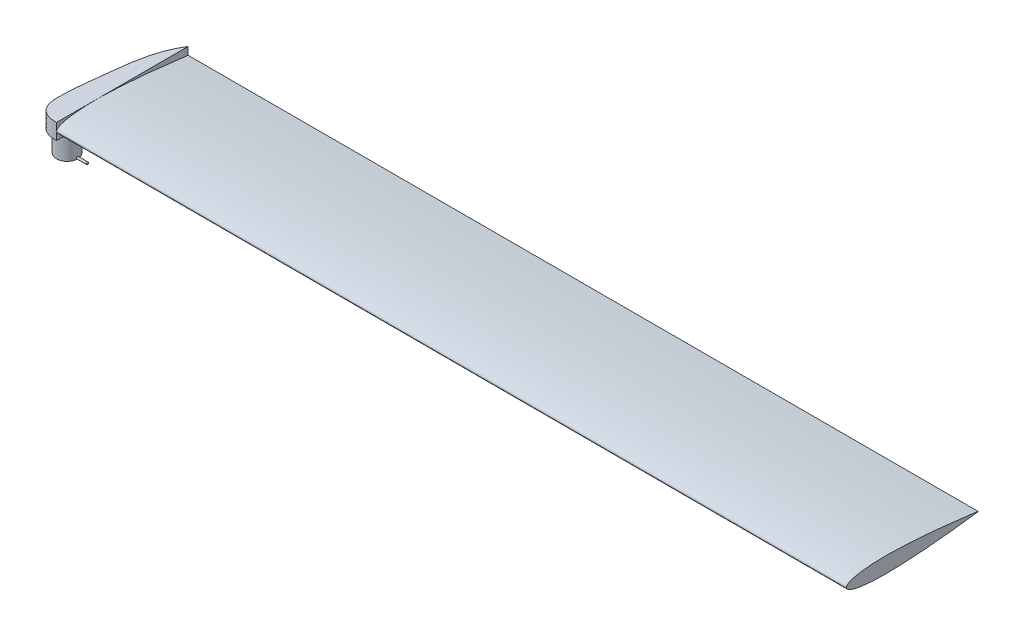
ISO-10303-21;
HEADER;
FILE_DESCRIPTION(('STEP AP214'),'2;1');
FILE_NAME('part.step','',(''),(''),'','','');
FILE_SCHEMA(('AUTOMOTIVE_DESIGN { 1 0 10303 214 1 1 1 1 }'));
ENDSEC;
DATA;
#1=APPLICATION_CONTEXT('core data for automotive mechanical design processes');
#2=APPLICATION_PROTOCOL_DEFINITION('international standard','automotive_design',2000,#1);
#3=PRODUCT_CONTEXT('',#1,'mechanical');
#4=PRODUCT('Part','Part','',(#3));
#5=PRODUCT_RELATED_PRODUCT_CATEGORY('part','',(#4));
#6=PRODUCT_DEFINITION_FORMATION('','',#4);
#7=PRODUCT_DEFINITION_CONTEXT('part definition',#1,'design');
#8=PRODUCT_DEFINITION('design','',#6,#7);
#9=PRODUCT_DEFINITION_SHAPE('','',#8);
#10=(LENGTH_UNIT() NAMED_UNIT(*) SI_UNIT(.MILLI.,.METRE.));
#11=(NAMED_UNIT(*) PLANE_ANGLE_UNIT() SI_UNIT($,.RADIAN.));
#12=(NAMED_UNIT(*) SI_UNIT($,.STERADIAN.) SOLID_ANGLE_UNIT());
#13=UNCERTAINTY_MEASURE_WITH_UNIT(LENGTH_MEASURE(1.E-05),#10,'distance_accuracy_value','');
#14=(GEOMETRIC_REPRESENTATION_CONTEXT(3) GLOBAL_UNCERTAINTY_ASSIGNED_CONTEXT((#13)) GLOBAL_UNIT_ASSIGNED_CONTEXT((#10,
#11,#12)) REPRESENTATION_CONTEXT('',''));
#15=CARTESIAN_POINT('',(0.,0.,0.));
#16=DIRECTION('',(0.,0.,1.));
#17=DIRECTION('',(1.,0.,0.));
#18=AXIS2_PLACEMENT_3D('',#15,#16,#17);
#19=CARTESIAN_POINT('',(-10.,-25.,-19.9998762848548));
#20=DIRECTION('',(0.,1.,0.));
#21=DIRECTION('',(0.,0.,1.));
#22=AXIS2_PLACEMENT_3D('',#19,#20,#21);
#23=CYLINDRICAL_SURFACE('',#22,10.);
#24=CARTESIAN_POINT('',(-10.,0.,-19.9998762848548));
#25=DIRECTION('',(0.,-1.,0.));
#26=DIRECTION('',(0.,0.,-1.));
#27=AXIS2_PLACEMENT_3D('',#24,#25,#26);
#28=CIRCLE('',#27,10.);
#29=CARTESIAN_POINT('',(0.,0.,-19.9998762848548));
#30=VERTEX_POINT('',#29);
#31=CARTESIAN_POINT('',(-19.9897457325701,0.,-19.5471288954677));
#32=VERTEX_POINT('',#31);
#33=EDGE_CURVE('E61',#30,#32,#28,.T.);
#34=ORIENTED_EDGE('',*,*,#33,.T.);
#35=CARTESIAN_POINT('',(-20.,0.,-19.9998762848548));
#36=CARTESIAN_POINT('',(-19.9960821326151,0.,-19.7722071167072));
#37=CARTESIAN_POINT('',(-19.9897457325701,0.,-19.5471288954679));
#38=B_SPLINE_CURVE_WITH_KNOTS('',2,(#35,#36,#37),.UNSPECIFIED.,.F.,.F.,(3,3),(0.988805697326739,
1.),.UNSPECIFIED.);
#39=CARTESIAN_POINT('',(-20.0000000000001,0.,-19.9998762848548));
#40=VERTEX_POINT('',#39);
#41=EDGE_CURVE('E120',#32,#40,#38,.F.);
#42=ORIENTED_EDGE('',*,*,#41,.T.);
#43=CARTESIAN_POINT('',(-10.,0.,-19.9998762848548));
#44=DIRECTION('',(0.,1.,0.));
#45=DIRECTION('',(0.,0.,1.));
#46=AXIS2_PLACEMENT_3D('',#43,#44,#45);
#47=CIRCLE('',#46,10.);
#48=EDGE_CURVE('E11',#40,#30,#47,.F.);
#49=ORIENTED_EDGE('',*,*,#48,.T.);
#50=EDGE_LOOP('',(#34,#42,#49));
#51=FACE_BOUND('',#50,.T.);
#52=CARTESIAN_POINT('',(-10.,-25.,-19.9998762848548));
#53=DIRECTION('',(0.,-1.,0.));
#54=DIRECTION('',(0.,0.,-1.));
#55=AXIS2_PLACEMENT_3D('',#52,#53,#54);
#56=CIRCLE('',#55,10.);
#57=CARTESIAN_POINT('',(0.,-25.,-19.9998762848548));
#58=VERTEX_POINT('',#57);
#59=EDGE_CURVE('E113',#58,#58,#56,.T.);
#60=ORIENTED_EDGE('',*,*,#59,.F.);
#61=CARTESIAN_POINT('',(-0.0501256289337955,-24.,-20.9998762848549));
#62=CARTESIAN_POINT('',(-0.0501249720309668,-23.9439804358264,-20.9998738582484));
#63=CARTESIAN_POINT('',(-0.0496474300578145,-23.8879238315882,-20.9951531438373));
#64=CARTESIAN_POINT('',(-0.0477891244188077,-23.7773648137065,-20.9763925996184));
#65=CARTESIAN_POINT('',(-0.0464073653878054,-23.7228641819625,-20.9623424997413));
#66=CARTESIAN_POINT('',(-0.0428986695261224,-23.6170341807821,-20.9253364009238));
#67=CARTESIAN_POINT('',(-0.0407721845320985,-23.5657029106086,-20.9023858011488));
#68=CARTESIAN_POINT('',(-0.0360141942817911,-23.4676322077082,-20.848240552246));
#69=CARTESIAN_POINT('',(-0.0333827893567064,-23.4208918655163,-20.8170475404808));
#70=CARTESIAN_POINT('',(-0.0279007329010098,-23.3331487363425,-20.7471810468536));
#71=CARTESIAN_POINT('',(-0.0250493999473345,-23.2921649904962,-20.7084837029631));
#72=CARTESIAN_POINT('',(-0.0194549476428063,-23.2172623909964,-20.6247580001744));
#73=CARTESIAN_POINT('',(-0.0167118332478677,-23.1833438605937,-20.5797293517614));
#74=CARTESIAN_POINT('',(-0.0116361684439486,-23.1234687429928,-20.4845026465058));
#75=CARTESIAN_POINT('',(-0.00930449105352558,-23.0975290012063,-20.4342939473844));
#76=CARTESIAN_POINT('',(-0.00532183124228876,-23.0544555668513,-20.3302062691424));
#77=CARTESIAN_POINT('',(-0.00367083222935588,-23.0373216596305,-20.2763273795231));
#78=CARTESIAN_POINT('',(-0.00124033428973726,-23.0124020906468,-20.1666210675978));
#79=CARTESIAN_POINT('',(-0.00045792157182856,-23.0045851672501,-20.1108008118864));
#80=CARTESIAN_POINT('',(0.000157155986929122,-22.9984247308663,-19.9986355441659));
#81=CARTESIAN_POINT('',(-1.01545472688703E-05,-23.0000809722537,-19.9422905458004));
#82=CARTESIAN_POINT('',(-0.00127328688813906,-23.0127944726502,-19.8308874407903));
#83=CARTESIAN_POINT('',(-0.00236578848286872,-23.0238181155639,-19.7758254549199));
#84=CARTESIAN_POINT('',(-0.00535270735069322,-23.0549011289466,-19.6683371053503));
#85=CARTESIAN_POINT('',(-0.00724713504046299,-23.0749606167876,-19.6159107758971));
#86=CARTESIAN_POINT('',(-0.0116306251608414,-23.1235827632544,-19.5150759701753));
#87=CARTESIAN_POINT('',(-0.0141207263424173,-23.1521602975302,-19.4666747138732));
#88=CARTESIAN_POINT('',(-0.0194161548059212,-23.2169965233364,-19.3753427716807));
#89=CARTESIAN_POINT('',(-0.0222214913318861,-23.2532554401452,-19.332412246294));
#90=CARTESIAN_POINT('',(-0.0278470653214824,-23.3326142295136,-19.2530435130322));
#91=CARTESIAN_POINT('',(-0.0306673142697208,-23.3757433447416,-19.2166345386645));
#92=CARTESIAN_POINT('',(-0.0359926007177727,-23.4675168652108,-19.1515687494969));
#93=CARTESIAN_POINT('',(-0.0384976377603513,-23.5161612784521,-19.122911945942));
#94=CARTESIAN_POINT('',(-0.0429091048585014,-23.6176070251998,-19.0741641002816));
#95=CARTESIAN_POINT('',(-0.0448154086744486,-23.6704092324229,-19.0540748642819));
#96=CARTESIAN_POINT('',(-0.0478109812906173,-23.7786606046147,-19.0230555492173));
#97=CARTESIAN_POINT('',(-0.0489002749823136,-23.8341096888874,-19.0121251911118));
#98=CARTESIAN_POINT('',(-0.0501341947258268,-23.9458241795295,-18.9997715094629));
#99=CARTESIAN_POINT('',(-0.0502828845239615,-24.0020850202648,-18.9983072882076));
#100=CARTESIAN_POINT('',(-0.0496294864522809,-24.1140512658229,-19.0048200379835));
#101=CARTESIAN_POINT('',(-0.0488274114293835,-24.1697566781404,-19.0127968814451));
#102=CARTESIAN_POINT('',(-0.0463665557759787,-24.2789115822783,-19.0379311103473));
#103=CARTESIAN_POINT('',(-0.0447095799865401,-24.3323655710947,-19.0550691576659));
#104=CARTESIAN_POINT('',(-0.0407270896120476,-24.4356400517303,-19.0980195651789));
#105=CARTESIAN_POINT('',(-0.0384015597132981,-24.4854604602872,-19.1238321240713));
#106=CARTESIAN_POINT('',(-0.0333341564428581,-24.5802399740288,-19.1835012834316));
#107=CARTESIAN_POINT('',(-0.0305908918532778,-24.6251819419663,-19.2173849850142));
#108=CARTESIAN_POINT('',(-0.0250016737481334,-24.7087550532741,-19.2921957514037));
#109=CARTESIAN_POINT('',(-0.0221557176913362,-24.7473860403401,-19.3331229906067));
#110=CARTESIAN_POINT('',(-0.0166695215069773,-24.8173816333981,-19.4210364806284));
#111=CARTESIAN_POINT('',(-0.0140300594452513,-24.8487195595862,-19.4680440288854));
#112=CARTESIAN_POINT('',(-0.00926557893369193,-24.9030558685064,-19.5666785674377));
#113=CARTESIAN_POINT('',(-0.00714055343507223,-24.9260543655071,-19.6183054944252));
#114=CARTESIAN_POINT('',(-0.00364789585994026,-24.9630137676553,-19.724620158422));
#115=CARTESIAN_POINT('',(-0.00227891394351001,-24.9769907873252,-19.7793022472049));
#116=CARTESIAN_POINT('',(-0.000447053863505013,-24.9955630695798,-19.8902514708712));
#117=CARTESIAN_POINT('',(1.58497656331245E-05,-25.000158595834,-19.9465185611626));
#118=CARTESIAN_POINT('',(-1.6616867299425E-05,-24.9998337335601,-20.0587785089306));
#119=CARTESIAN_POINT('',(-0.00050781623329914,-24.9949547631633,-20.1147714920794));
#120=CARTESIAN_POINT('',(-0.00238506422408651,-24.975906254343,-20.2251381732112));
#121=CARTESIAN_POINT('',(-0.0037711135512627,-24.961736708627,-20.2795118699232));
#122=CARTESIAN_POINT('',(-0.00728276186038155,-24.9245207426071,-20.3850961936226));
#123=CARTESIAN_POINT('',(-0.0094082599675069,-24.9014755330658,-20.4363072509324));
#124=CARTESIAN_POINT('',(-0.0141618758370362,-24.847166831083,-20.5341408850097));
#125=CARTESIAN_POINT('',(-0.0167899906584483,-24.8159033867289,-20.5807634886234));
#126=CARTESIAN_POINT('',(-0.0222681533094456,-24.7458903809762,-20.6683090092818));
#127=CARTESIAN_POINT('',(-0.0251190853930051,-24.7071099837552,-20.7092072110742));
#128=CARTESIAN_POINT('',(-0.0307140923034132,-24.6232246484546,-20.783934044248));
#129=CARTESIAN_POINT('',(-0.0334581413222291,-24.5781181948309,-20.8177609767027));
#130=CARTESIAN_POINT('',(-0.0385361658939886,-24.4827356580801,-20.8774529252789));
#131=CARTESIAN_POINT('',(-0.0408690807469333,-24.4324467186759,-20.9032974728497));
#132=CARTESIAN_POINT('',(-0.0448480523753763,-24.3282517087538,-20.9461409929536));
#133=CARTESIAN_POINT('',(-0.0464948834664029,-24.2743497960743,-20.9631499427447));
#134=CARTESIAN_POINT('',(-0.0484999246185467,-24.1834522591009,-20.9835979731884));
#135=CARTESIAN_POINT('',(-0.0491066806430561,-24.1470377486936,-20.9896939972531));
#136=CARTESIAN_POINT('',(-0.0499197482233644,-24.0737541769575,-20.99783394346));
#137=CARTESIAN_POINT('',(-0.0501260614601531,-24.0368851175374,-20.9998778826121));
#138=CARTESIAN_POINT('',(-0.0501256289337955,-24.,-20.9998762848549));
#139=B_SPLINE_CURVE_WITH_KNOTS('',3,(#61,#62,#63,#64,#65,#66,#67,#68,#69,#70,#71,#72,#73,#74,
#75,#76,#77,#78,#79,#80,#81,#82,#83,#84,#85,#86,#87,#88,#89,#90,#91,#92,#93,#94,#95,#96,#97,#98,
#99,#100,#101,#102,#103,#104,#105,#106,#107,#108,#109,#110,#111,#112,#113,#114,#115,#116,#117,
#118,#119,#120,#121,#122,#123,#124,#125,#126,#127,#128,#129,#130,#131,#132,#133,#134,#135,#136,
#137,#138),.UNSPECIFIED.,.T.,.F.,(4,2,2,2,2,2,2,2,2,2,2,2,2,2,2,2,2,2,2,2,2,2,2,2,2,2,2,2,2,2,2,
2,2,2,2,2,2,2,4),(0.,0.16792399443646,0.33603315182177,0.504040490997475,0.672014480421315,
0.840531615299249,1.00905645855253,1.17793469971292,1.34680882407795,1.5151147089845,
1.68341622998233,1.85111631818662,2.01881858480975,2.18681545466414,2.35481725218529,
2.52355425085001,2.69229149427563,2.86106429117934,3.02983194595033,3.19786996307766,
3.36590570966871,3.53358814704528,3.70127442561048,3.86953189811719,4.03779353723203,
4.2066613681812,4.37552688518005,4.54408992694362,4.7126482311315,4.88047133468484,
5.04829456996659,5.21609491995247,5.383894288108,5.5523971503799,5.72094045034526,
5.88991241070477,6.05869314894002,6.16926027606047,6.27982693903816),.UNSPECIFIED.);
#140=EDGE_CURVE('E115',#58,#58,#139,.T.);
#141=ORIENTED_EDGE('',*,*,#140,.F.);
#142=EDGE_LOOP('',(#60,#141));
#143=FACE_BOUND('',#142,.T.);
#144=ADVANCED_FACE('F41',(#51,#143),#23,.T.);
#145=CARTESIAN_POINT('',(0.,0.,0.));
#146=DIRECTION('',(0.,1.,0.));
#147=DIRECTION('',(0.,0.,1.));
#148=AXIS2_PLACEMENT_3D('',#145,#146,#147);
#149=PLANE('',#148);
#150=ORIENTED_EDGE('',*,*,#48,.F.);
#151=CARTESIAN_POINT('',(-20.,0.,-19.9998762848548));
#152=CARTESIAN_POINT('',(-20.25649122117,0.,-33.6052371083741));
#153=CARTESIAN_POINT('',(-15.1417465608005,0.,-69.2209750979923));
#154=CARTESIAN_POINT('',(-12.666672021234,0.,-105.011543661617));
#155=CARTESIAN_POINT('',(0.,0.,-124.995841148639));
#156=B_SPLINE_CURVE_WITH_KNOTS('',3,(#151,#152,#153,#154,#155),.UNSPECIFIED.,.F.,.F.,(4,1,4),
(0.,0.363918554591473,1.),.UNSPECIFIED.);
#157=CARTESIAN_POINT('',(0.,0.,-124.995841148639));
#158=VERTEX_POINT('',#157);
#159=EDGE_CURVE('E117',#40,#158,#156,.T.);
#160=ORIENTED_EDGE('',*,*,#159,.T.);
#161=DIRECTION('',(0.,0.,1.));
#162=VECTOR('',#161,1.);
#163=CARTESIAN_POINT('',(0.,0.,0.));
#164=LINE('',#163,#162);
#165=EDGE_CURVE('E186',#158,#30,#164,.T.);
#166=ORIENTED_EDGE('',*,*,#165,.T.);
#167=EDGE_LOOP('',(#150,#160,#166));
#168=FACE_BOUND('',#167,.T.);
#169=ADVANCED_FACE('F150',(#168),#149,.F.);
#170=CARTESIAN_POINT('',(750.,7.69748541026481,-124.995841148639));
#171=CARTESIAN_POINT('',(750.,8.13297079806969,-121.549441339967));
#172=CARTESIAN_POINT('',(750.,8.8711094317515,-115.707865670304));
#173=CARTESIAN_POINT('',(750.,10.001168495884,-106.612829462784));
#174=CARTESIAN_POINT('',(750.,10.900080960327,-98.7766774485687));
#175=CARTESIAN_POINT('',(750.,11.7180797430692,-91.0104309827742));
#176=CARTESIAN_POINT('',(750.,12.374421583348,-84.4661711660079));
#177=CARTESIAN_POINT('',(750.,13.0108919100097,-77.1231270334049));
#178=CARTESIAN_POINT('',(750.,13.6615586610674,-70.096902966347));
#179=CARTESIAN_POINT('',(750.,14.0382624320619,-63.2321869691896));
#180=CARTESIAN_POINT('',(750.,14.4586464854716,-56.9511833567442));
#181=CARTESIAN_POINT('',(750.,14.7447792836539,-50.1830543119707));
#182=CARTESIAN_POINT('',(750.,14.9288477277546,-43.7131494322692));
#183=CARTESIAN_POINT('',(750.,14.9867694495661,-38.0167473663419));
#184=CARTESIAN_POINT('',(750.,14.9641673572682,-31.8671085177231));
#185=CARTESIAN_POINT('',(750.,14.7641718889759,-25.9611084011886));
#186=CARTESIAN_POINT('',(750.,14.3189228100668,-20.4184783683121));
#187=CARTESIAN_POINT('',(750.,13.9020772787466,-16.0808939192611));
#188=CARTESIAN_POINT('',(750.,13.2766805127196,-11.948417440773));
#189=CARTESIAN_POINT('',(750.,12.4387478677314,-7.87202213430819));
#190=CARTESIAN_POINT('',(750.,11.4815907628938,-4.55145990959005));
#191=CARTESIAN_POINT('',(750.,10.1896156908138,-1.93507828303653));
#192=CARTESIAN_POINT('',(750.,8.86775259773538,-0.419790589282026));
#193=CARTESIAN_POINT('',(750.,7.67644804525767,0.11632820232294));
#194=CARTESIAN_POINT('',(750.,6.57571630783656,-0.228543288672665));
#195=CARTESIAN_POINT('',(750.,5.38282804272362,-1.09205976929891));
#196=CARTESIAN_POINT('',(750.,4.18267580665148,-3.12132983163146));
#197=CARTESIAN_POINT('',(750.,3.12236016112023,-5.83394586751756));
#198=CARTESIAN_POINT('',(750.,2.33803973933592,-8.96942484585597));
#199=CARTESIAN_POINT('',(750.,1.63555506566896,-12.4549344479186));
#200=CARTESIAN_POINT('',(750.,1.0576222452614,-16.3980412905516));
#201=CARTESIAN_POINT('',(750.,0.619305341649041,-20.4073734698152));
#202=CARTESIAN_POINT('',(750.,0.31851410484638,-24.9404968445985));
#203=CARTESIAN_POINT('',(750.,0.0979146932351296,-28.9969109003526));
#204=CARTESIAN_POINT('',(750.,0.0649508194327663,-33.6403576750407));
#205=CARTESIAN_POINT('',(750.,-0.00877400175199696,-37.6198248379226));
#206=CARTESIAN_POINT('',(750.,0.015166900275881,-42.1302311610639));
#207=CARTESIAN_POINT('',(750.,0.12809961974748,-46.8254786090486));
#208=CARTESIAN_POINT('',(750.,0.308197082911385,-52.0592292594811));
#209=CARTESIAN_POINT('',(750.,0.566048003035137,-57.5702731705481));
#210=CARTESIAN_POINT('',(750.,0.903534980744857,-63.0665569396856));
#211=CARTESIAN_POINT('',(750.,1.27356010427155,-68.7815874397308));
#212=CARTESIAN_POINT('',(750.,1.70119585281695,-74.2410513997578));
#213=CARTESIAN_POINT('',(750.,2.13196813018693,-79.3320789909935));
#214=CARTESIAN_POINT('',(750.,2.52583779535599,-83.7651352480584));
#215=CARTESIAN_POINT('',(750.,3.01497217512738,-88.3338625479964));
#216=CARTESIAN_POINT('',(750.,3.49549121200945,-93.4518819084549));
#217=CARTESIAN_POINT('',(750.,4.03066318219639,-98.4485149275409));
#218=CARTESIAN_POINT('',(750.,4.55967089304909,-103.359945305802));
#219=CARTESIAN_POINT('',(750.,5.05105140142525,-107.534749069242));
#220=CARTESIAN_POINT('',(750.,5.65258932830013,-112.036034411145));
#221=CARTESIAN_POINT('',(750.,6.20511451438241,-116.898948087647));
#222=CARTESIAN_POINT('',(750.,6.89818955039857,-121.185254011004));
#223=CARTESIAN_POINT('',(750.,7.13557750543474,-124.034905271131));
#224=CARTESIAN_POINT('',(750.,7.32673022277285,-124.871587069256));
#225=CARTESIAN_POINT('',(750.,7.3551179622547,-124.995841148639));
#226=B_SPLINE_CURVE_WITH_KNOTS('',3,(#170,#171,#172,#173,#174,#175,#176,#177,#178,#179,#180,
#181,#182,#183,#184,#185,#186,#187,#188,#189,#190,#191,#192,#193,#194,#195,#196,#197,#198,#199,
#200,#201,#202,#203,#204,#205,#206,#207,#208,#209,#210,#211,#212,#213,#214,#215,#216,#217,#218,
#219,#220,#221,#222,#223,#224,#225),.UNSPECIFIED.,.F.,.F.,(4,1,1,1,1,1,1,1,1,1,1,1,1,1,1,1,1,1,
1,1,1,1,1,1,1,1,1,1,1,1,1,1,1,1,1,1,1,1,1,1,1,1,1,1,1,1,1,1,1,1,1,1,1,4),(0.,0.0409096927672382,
0.069341074509443,0.107932085318759,0.13379571453232,0.16130729717174,0.185385503767664,
0.220597865919934,0.244393633444343,0.266343568343719,0.294730889223809,0.324163187557855,
0.342565083334242,0.361815516183744,0.396586444452688,0.412117027739434,0.427295280855564,
0.447896389869057,0.461301180767998,0.476284913180007,0.488528162874039,0.495261637278021,
0.499815716845931,0.502760784822896,0.508369898484513,0.516837025917484,0.529992214815813,
0.542688858921217,0.554812189598935,0.571870003296213,0.589595673628932,0.602296180079901,
0.625369139144534,0.637420540621771,0.656976539844779,0.672241266584835,0.690533980122457,
0.712285020909276,0.733912637938034,0.755503976489473,0.777133728985755,0.801356586058894,
0.819993044264083,0.837303590830548,0.853766864034959,0.874103184409616,0.897840615251757,
0.912945775380075,0.93227821936547,0.947341946687704,0.966428855971776,0.989896212666448,
0.998499505073226,1.),.UNSPECIFIED.);
#227=DIRECTION('',(-1.,0.,0.));
#228=VECTOR('',#227,1.);
#229=SURFACE_OF_LINEAR_EXTRUSION('',#226,#228);
#230=CARTESIAN_POINT('',(0.,7.69748541026481,-124.995841148639));
#231=CARTESIAN_POINT('',(0.,8.13297079806969,-121.549441339967));
#232=CARTESIAN_POINT('',(0.,8.8711094317515,-115.707865670304));
#233=CARTESIAN_POINT('',(0.,10.001168495884,-106.612829462784));
#234=CARTESIAN_POINT('',(0.,10.900080960327,-98.7766774485687));
#235=CARTESIAN_POINT('',(0.,11.7180797430692,-91.0104309827742));
#236=CARTESIAN_POINT('',(0.,12.374421583348,-84.4661711660079));
#237=CARTESIAN_POINT('',(0.,13.0108919100097,-77.1231270334049));
#238=CARTESIAN_POINT('',(0.,13.6615586610674,-70.096902966347));
#239=CARTESIAN_POINT('',(0.,14.0382624320619,-63.2321869691896));
#240=CARTESIAN_POINT('',(0.,14.4586464854716,-56.9511833567442));
#241=CARTESIAN_POINT('',(0.,14.7447792836539,-50.1830543119707));
#242=CARTESIAN_POINT('',(0.,14.9288477277546,-43.7131494322692));
#243=CARTESIAN_POINT('',(0.,14.9867694495661,-38.0167473663419));
#244=CARTESIAN_POINT('',(0.,14.9641673572682,-31.8671085177231));
#245=CARTESIAN_POINT('',(0.,14.7641718889759,-25.9611084011886));
#246=CARTESIAN_POINT('',(0.,14.3189228100668,-20.4184783683121));
#247=CARTESIAN_POINT('',(0.,13.9020772787466,-16.0808939192611));
#248=CARTESIAN_POINT('',(0.,13.2766805127196,-11.948417440773));
#249=CARTESIAN_POINT('',(0.,12.4387478677314,-7.87202213430819));
#250=CARTESIAN_POINT('',(0.,11.4815907628938,-4.55145990959005));
#251=CARTESIAN_POINT('',(0.,10.1896156908138,-1.93507828303653));
#252=CARTESIAN_POINT('',(0.,8.86775259773538,-0.419790589282026));
#253=CARTESIAN_POINT('',(0.,7.67644804525767,0.11632820232294));
#254=CARTESIAN_POINT('',(0.,6.57571630783656,-0.228543288672665));
#255=CARTESIAN_POINT('',(0.,5.38282804272362,-1.09205976929891));
#256=CARTESIAN_POINT('',(0.,4.18267580665148,-3.12132983163146));
#257=CARTESIAN_POINT('',(0.,3.12236016112023,-5.83394586751756));
#258=CARTESIAN_POINT('',(0.,2.33803973933592,-8.96942484585597));
#259=CARTESIAN_POINT('',(0.,1.63555506566896,-12.4549344479186));
#260=CARTESIAN_POINT('',(0.,1.0576222452614,-16.3980412905516));
#261=CARTESIAN_POINT('',(0.,0.619305341649041,-20.4073734698152));
#262=CARTESIAN_POINT('',(0.,0.31851410484638,-24.9404968445985));
#263=CARTESIAN_POINT('',(0.,0.0979146932351296,-28.9969109003526));
#264=CARTESIAN_POINT('',(0.,0.0649508194327663,-33.6403576750407));
#265=CARTESIAN_POINT('',(0.,-0.00877400175199696,-37.6198248379226));
#266=CARTESIAN_POINT('',(0.,0.015166900275881,-42.1302311610639));
#267=CARTESIAN_POINT('',(0.,0.12809961974748,-46.8254786090486));
#268=CARTESIAN_POINT('',(0.,0.308197082911385,-52.0592292594811));
#269=CARTESIAN_POINT('',(0.,0.566048003035137,-57.5702731705481));
#270=CARTESIAN_POINT('',(0.,0.903534980744857,-63.0665569396856));
#271=CARTESIAN_POINT('',(0.,1.27356010427155,-68.7815874397308));
#272=CARTESIAN_POINT('',(0.,1.70119585281695,-74.2410513997578));
#273=CARTESIAN_POINT('',(0.,2.13196813018693,-79.3320789909935));
#274=CARTESIAN_POINT('',(0.,2.52583779535599,-83.7651352480584));
#275=CARTESIAN_POINT('',(0.,3.01497217512738,-88.3338625479964));
#276=CARTESIAN_POINT('',(0.,3.49549121200945,-93.4518819084549));
#277=CARTESIAN_POINT('',(0.,4.03066318219639,-98.4485149275409));
#278=CARTESIAN_POINT('',(0.,4.55967089304909,-103.359945305802));
#279=CARTESIAN_POINT('',(0.,5.05105140142525,-107.534749069242));
#280=CARTESIAN_POINT('',(0.,5.65258932830013,-112.036034411145));
#281=CARTESIAN_POINT('',(0.,6.20511451438241,-116.898948087647));
#282=CARTESIAN_POINT('',(0.,6.89818955039857,-121.185254011004));
#283=CARTESIAN_POINT('',(0.,7.13557750543474,-124.034905271131));
#284=CARTESIAN_POINT('',(0.,7.32673022277285,-124.871587069256));
#285=CARTESIAN_POINT('',(0.,7.3551179622547,-124.995841148639));
#286=B_SPLINE_CURVE_WITH_KNOTS('',3,(#230,#231,#232,#233,#234,#235,#236,#237,#238,#239,#240,
#241,#242,#243,#244,#245,#246,#247,#248,#249,#250,#251,#252,#253,#254,#255,#256,#257,#258,#259,
#260,#261,#262,#263,#264,#265,#266,#267,#268,#269,#270,#271,#272,#273,#274,#275,#276,#277,#278,
#279,#280,#281,#282,#283,#284,#285),.UNSPECIFIED.,.F.,.F.,(4,1,1,1,1,1,1,1,1,1,1,1,1,1,1,1,1,1,
1,1,1,1,1,1,1,1,1,1,1,1,1,1,1,1,1,1,1,1,1,1,1,1,1,1,1,1,1,1,1,1,1,1,1,4),(0.,0.0409096927672382,
0.069341074509443,0.107932085318759,0.13379571453232,0.16130729717174,0.185385503767664,
0.220597865919934,0.244393633444343,0.266343568343719,0.294730889223809,0.324163187557855,
0.342565083334242,0.361815516183744,0.396586444452688,0.412117027739434,0.427295280855564,
0.447896389869057,0.461301180767998,0.476284913180007,0.488528162874039,0.495261637278021,
0.499815716845931,0.502760784822896,0.508369898484513,0.516837025917484,0.529992214815813,
0.542688858921217,0.554812189598935,0.571870003296213,0.589595673628932,0.602296180079901,
0.625369139144534,0.637420540621771,0.656976539844779,0.672241266584835,0.690533980122457,
0.712285020909276,0.733912637938034,0.755503976489473,0.777133728985755,0.801356586058894,
0.819993044264083,0.837303590830548,0.853766864034959,0.874103184409616,0.897840615251757,
0.912945775380075,0.93227821936547,0.947341946687704,0.966428855971776,0.989896212666448,
0.998499505073226,1.),.UNSPECIFIED.);
#287=CARTESIAN_POINT('',(0.,7.69748541026481,-124.995841148639));
#288=VERTEX_POINT('',#287);
#289=CARTESIAN_POINT('',(0.,7.55858231577554,0.000123715145150439));
#290=VERTEX_POINT('',#289);
#291=EDGE_CURVE('E206',#288,#290,#286,.T.);
#292=ORIENTED_EDGE('',*,*,#291,.T.);
#293=CARTESIAN_POINT('',(0.,7.3551179622547,-124.995841148639));
#294=VERTEX_POINT('',#293);
#295=EDGE_CURVE('E211',#290,#294,#286,.T.);
#296=ORIENTED_EDGE('',*,*,#295,.T.);
#297=DIRECTION('',(-1.,0.,0.));
#298=VECTOR('',#297,1.);
#299=CARTESIAN_POINT('',(750.,7.3551179622547,-124.995841148639));
#300=LINE('',#299,#298);
#301=CARTESIAN_POINT('',(750.,7.3551179622547,-124.995841148639));
#302=VERTEX_POINT('',#301);
#303=EDGE_CURVE('E53',#302,#294,#300,.T.);
#304=ORIENTED_EDGE('',*,*,#303,.F.);
#305=CARTESIAN_POINT('',(750.,7.69748541026481,-124.995841148639));
#306=VERTEX_POINT('',#305);
#307=EDGE_CURVE('E195',#306,#302,#226,.T.);
#308=ORIENTED_EDGE('',*,*,#307,.F.);
#309=DIRECTION('',(-1.,0.,0.));
#310=VECTOR('',#309,1.);
#311=CARTESIAN_POINT('',(750.,7.69748541026481,-124.995841148639));
#312=LINE('',#311,#310);
#313=EDGE_CURVE('E205',#306,#288,#312,.T.);
#314=ORIENTED_EDGE('',*,*,#313,.T.);
#315=EDGE_LOOP('',(#292,#296,#304,#308,#314));
#316=FACE_BOUND('',#315,.T.);
#317=ADVANCED_FACE('F43',(#316),#229,.F.);
#318=CARTESIAN_POINT('',(750.,7.69748541026481,-124.995841148639));
#319=DIRECTION('',(0.,0.,1.));
#320=DIRECTION('',(1.,0.,0.));
#321=AXIS2_PLACEMENT_3D('',#318,#319,#320);
#322=PLANE('',#321);
#323=DIRECTION('',(0.,1.,0.));
#324=VECTOR('',#323,1.);
#325=CARTESIAN_POINT('',(0.,7.69748541026481,-124.995841148639));
#326=LINE('',#325,#324);
#327=EDGE_CURVE('E200',#294,#288,#326,.T.);
#328=ORIENTED_EDGE('',*,*,#327,.T.);
#329=ORIENTED_EDGE('',*,*,#313,.F.);
#330=DIRECTION('',(0.,1.,0.));
#331=VECTOR('',#330,1.);
#332=CARTESIAN_POINT('',(750.,7.69748541026481,-124.995841148639));
#333=LINE('',#332,#331);
#334=EDGE_CURVE('E69',#302,#306,#333,.T.);
#335=ORIENTED_EDGE('',*,*,#334,.F.);
#336=ORIENTED_EDGE('',*,*,#303,.T.);
#337=EDGE_LOOP('',(#328,#329,#335,#336));
#338=FACE_BOUND('',#337,.T.);
#339=ADVANCED_FACE('F240',(#338),#322,.F.);
#340=CARTESIAN_POINT('',(750.,7.49465768006498,-0.00151174548001802));
#341=DIRECTION('',(-1.,0.,0.));
#342=DIRECTION('',(0.,0.,1.));
#343=AXIS2_PLACEMENT_3D('',#340,#341,#342);
#344=PLANE('',#343);
#345=ORIENTED_EDGE('',*,*,#307,.T.);
#346=ORIENTED_EDGE('',*,*,#334,.T.);
#347=EDGE_LOOP('',(#345,#346));
#348=FACE_BOUND('',#347,.T.);
#349=ADVANCED_FACE('F165',(#348),#344,.F.);
#350=CARTESIAN_POINT('',(0.,15.,0.));
#351=DIRECTION('',(1.,0.,0.));
#352=DIRECTION('',(0.,0.,-1.));
#353=AXIS2_PLACEMENT_3D('',#350,#351,#352);
#354=PLANE('',#353);
#355=ORIENTED_EDGE('',*,*,#291,.F.);
#356=DIRECTION('',(0.,-1.,0.));
#357=VECTOR('',#356,1.);
#358=CARTESIAN_POINT('',(0.,15.,-124.995841148639));
#359=LINE('',#358,#357);
#360=CARTESIAN_POINT('',(0.,15.,-124.995841148639));
#361=VERTEX_POINT('',#360);
#362=EDGE_CURVE('E80',#361,#288,#359,.T.);
#363=ORIENTED_EDGE('',*,*,#362,.F.);
#364=DIRECTION('',(0.,0.,1.));
#365=VECTOR('',#364,1.);
#366=CARTESIAN_POINT('',(0.,15.,0.));
#367=LINE('',#366,#365);
#368=CARTESIAN_POINT('',(0.,15.,0.000123715145150439));
#369=VERTEX_POINT('',#368);
#370=EDGE_CURVE('E180',#361,#369,#367,.T.);
#371=ORIENTED_EDGE('',*,*,#370,.T.);
#372=DIRECTION('',(0.,-1.,0.));
#373=VECTOR('',#372,1.);
#374=CARTESIAN_POINT('',(0.,15.,0.000123715145150439));
#375=LINE('',#374,#373);
#376=EDGE_CURVE('E192',#369,#290,#375,.T.);
#377=ORIENTED_EDGE('',*,*,#376,.T.);
#378=EDGE_LOOP('',(#355,#363,#371,#377));
#379=FACE_BOUND('',#378,.T.);
#380=ADVANCED_FACE('F161',(#379),#354,.T.);
#381=ORIENTED_EDGE('',*,*,#295,.F.);
#382=CARTESIAN_POINT('',(0.,0.,0.000123715145150439));
#383=VERTEX_POINT('',#382);
#384=EDGE_CURVE('E191',#290,#383,#375,.T.);
#385=ORIENTED_EDGE('',*,*,#384,.T.);
#386=EDGE_CURVE('E189',#30,#383,#164,.T.);
#387=ORIENTED_EDGE('',*,*,#386,.F.);
#388=ORIENTED_EDGE('',*,*,#165,.F.);
#389=EDGE_CURVE('E88',#294,#158,#359,.T.);
#390=ORIENTED_EDGE('',*,*,#389,.F.);
#391=EDGE_LOOP('',(#381,#385,#387,#388,#390));
#392=FACE_BOUND('',#391,.T.);
#393=ADVANCED_FACE('F164',(#392),#354,.T.);
#394=CARTESIAN_POINT('',(-20.,15.,-19.9998762848548));
#395=CARTESIAN_POINT('',(-20.25649122117,15.,-33.6052371083741));
#396=CARTESIAN_POINT('',(-15.1417465608005,15.,-69.2209750979923));
#397=CARTESIAN_POINT('',(-12.666672021234,15.,-105.011543661617));
#398=CARTESIAN_POINT('',(0.,15.,-124.995841148639));
#399=B_SPLINE_CURVE_WITH_KNOTS('',3,(#394,#395,#396,#397,#398),.UNSPECIFIED.,.F.,.F.,(4,1,4),
(0.,0.363918554591473,1.),.UNSPECIFIED.);
#400=DIRECTION('',(0.,-1.,0.));
#401=VECTOR('',#400,1.);
#402=SURFACE_OF_LINEAR_EXTRUSION('',#399,#401);
#403=ORIENTED_EDGE('',*,*,#159,.F.);
#404=DIRECTION('',(0.,-1.,0.));
#405=VECTOR('',#404,1.);
#406=CARTESIAN_POINT('',(-20.0000000000001,15.,-19.9998762848548));
#407=LINE('',#406,#405);
#408=CARTESIAN_POINT('',(-20.0000000000001,15.,-19.9998762848548));
#409=VERTEX_POINT('',#408);
#410=EDGE_CURVE('E194',#409,#40,#407,.T.);
#411=ORIENTED_EDGE('',*,*,#410,.F.);
#412=EDGE_CURVE('E136',#409,#361,#399,.T.);
#413=ORIENTED_EDGE('',*,*,#412,.T.);
#414=ORIENTED_EDGE('',*,*,#362,.T.);
#415=ORIENTED_EDGE('',*,*,#327,.F.);
#416=ORIENTED_EDGE('',*,*,#389,.T.);
#417=EDGE_LOOP('',(#403,#411,#413,#414,#415,#416));
#418=FACE_BOUND('',#417,.T.);
#419=ADVANCED_FACE('F170',(#418),#402,.T.);
#420=CARTESIAN_POINT('',(0.,15.,0.000123715145150439));
#421=CARTESIAN_POINT('',(-19.6500123769003,15.,0.338073723545309));
#422=CARTESIAN_POINT('',(-20.,15.,-19.9998762848548));
#423=B_SPLINE_CURVE_WITH_KNOTS('',2,(#420,#421,#422),.UNSPECIFIED.,.F.,.F.,(3,3),(0.,1.),.UNSPECIFIED.);
#424=DIRECTION('',(0.,-1.,0.));
#425=VECTOR('',#424,1.);
#426=SURFACE_OF_LINEAR_EXTRUSION('',#423,#425);
#427=CARTESIAN_POINT('',(0.,0.,0.000123715145150439));
#428=CARTESIAN_POINT('',(-19.6500123769003,0.,0.338073723545309));
#429=CARTESIAN_POINT('',(-20.,0.,-19.9998762848548));
#430=B_SPLINE_CURVE_WITH_KNOTS('',2,(#427,#428,#429),.UNSPECIFIED.,.F.,.F.,(3,3),(0.,1.),.UNSPECIFIED.);
#431=EDGE_CURVE('E255',#383,#32,#430,.T.);
#432=ORIENTED_EDGE('',*,*,#431,.F.);
#433=ORIENTED_EDGE('',*,*,#384,.F.);
#434=ORIENTED_EDGE('',*,*,#376,.F.);
#435=EDGE_CURVE('E174',#369,#409,#423,.T.);
#436=ORIENTED_EDGE('',*,*,#435,.T.);
#437=ORIENTED_EDGE('',*,*,#410,.T.);
#438=ORIENTED_EDGE('',*,*,#41,.F.);
#439=EDGE_LOOP('',(#432,#433,#434,#436,#437,#438));
#440=FACE_BOUND('',#439,.T.);
#441=ADVANCED_FACE('F157',(#440),#426,.T.);
#442=CARTESIAN_POINT('',(0.,15.,0.));
#443=DIRECTION('',(0.,1.,0.));
#444=DIRECTION('',(0.,0.,1.));
#445=AXIS2_PLACEMENT_3D('',#442,#443,#444);
#446=PLANE('',#445);
#447=ORIENTED_EDGE('',*,*,#412,.F.);
#448=ORIENTED_EDGE('',*,*,#435,.F.);
#449=ORIENTED_EDGE('',*,*,#370,.F.);
#450=EDGE_LOOP('',(#447,#448,#449));
#451=FACE_BOUND('',#450,.T.);
#452=ADVANCED_FACE('F153',(#451),#446,.T.);
#453=ORIENTED_EDGE('',*,*,#33,.F.);
#454=ORIENTED_EDGE('',*,*,#386,.T.);
#455=ORIENTED_EDGE('',*,*,#431,.T.);
#456=EDGE_LOOP('',(#453,#454,#455));
#457=FACE_BOUND('',#456,.T.);
#458=ADVANCED_FACE('F156',(#457),#149,.F.);
#459=CARTESIAN_POINT('',(-10.,-25.,-19.9998762848548));
#460=DIRECTION('',(0.,-1.,0.));
#461=DIRECTION('',(0.,0.,-1.));
#462=AXIS2_PLACEMENT_3D('',#459,#460,#461);
#463=PLANE('',#462);
#464=ORIENTED_EDGE('',*,*,#59,.T.);
#465=EDGE_LOOP('',(#464));
#466=FACE_BOUND('',#465,.T.);
#467=ADVANCED_FACE('F151',(#466),#463,.T.);
#468=CARTESIAN_POINT('',(9.5,-24.,-19.9998762848549));
#469=DIRECTION('',(-1.,0.,0.));
#470=DIRECTION('',(0.,0.,1.));
#471=AXIS2_PLACEMENT_3D('',#468,#469,#470);
#472=CYLINDRICAL_SURFACE('',#471,1.);
#473=CARTESIAN_POINT('',(9.5,-24.,-19.9998762848549));
#474=DIRECTION('',(1.,0.,0.));
#475=DIRECTION('',(0.,0.,-1.));
#476=AXIS2_PLACEMENT_3D('',#473,#474,#475);
#477=CIRCLE('',#476,1.);
#478=CARTESIAN_POINT('',(9.5,-24.,-20.9998762848549));
#479=VERTEX_POINT('',#478);
#480=EDGE_CURVE('E121',#479,#479,#477,.T.);
#481=ORIENTED_EDGE('',*,*,#480,.F.);
#482=EDGE_LOOP('',(#481));
#483=FACE_BOUND('',#482,.T.);
#484=ORIENTED_EDGE('',*,*,#140,.T.);
#485=EDGE_LOOP('',(#484));
#486=FACE_BOUND('',#485,.T.);
#487=ADVANCED_FACE('F305',(#483,#486),#472,.T.);
#488=CARTESIAN_POINT('',(9.5,-24.,-19.9998762848549));
#489=DIRECTION('',(1.,0.,0.));
#490=DIRECTION('',(0.,0.,-1.));
#491=AXIS2_PLACEMENT_3D('',#488,#489,#490);
#492=PLANE('',#491);
#493=ORIENTED_EDGE('',*,*,#480,.T.);
#494=EDGE_LOOP('',(#493));
#495=FACE_BOUND('',#494,.T.);
#496=ADVANCED_FACE('F318',(#495),#492,.T.);
#497=CLOSED_SHELL('',(#144,#169,#317,#339,#349,#380,#393,#419,#441,#452,#458,#467,#487,#496));
#498=MANIFOLD_SOLID_BREP('B2',#497);
#499=ADVANCED_BREP_SHAPE_REPRESENTATION('',(#18,#498),#14);
#500=SHAPE_DEFINITION_REPRESENTATION(#9,#499);
ENDSEC;
END-ISO-10303-21;
